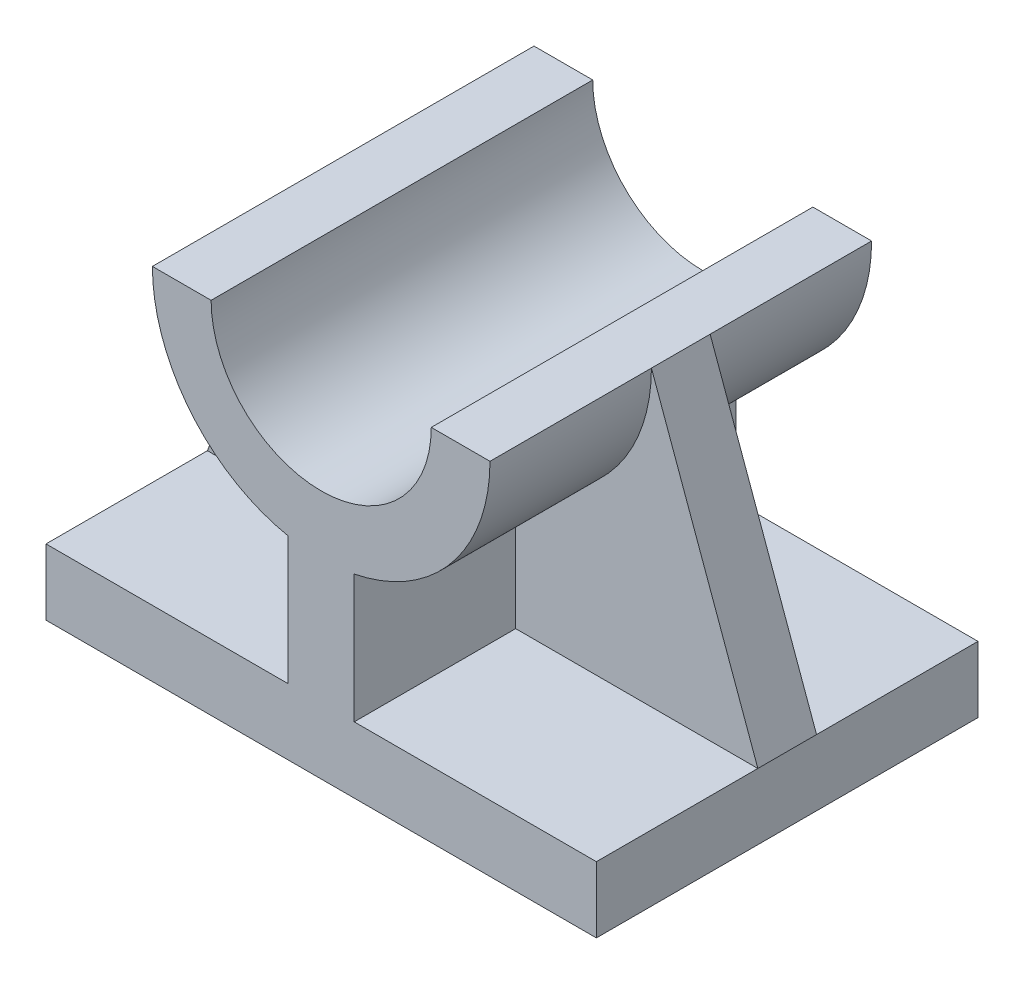
ISO-10303-21;
HEADER;
FILE_DESCRIPTION(('STEP AP214'),'2;1');
FILE_NAME('part.step','',(''),(''),'','','');
FILE_SCHEMA(('AUTOMOTIVE_DESIGN { 1 0 10303 214 1 1 1 1 }'));
ENDSEC;
DATA;
#1=APPLICATION_CONTEXT('core data for automotive mechanical design processes');
#2=APPLICATION_PROTOCOL_DEFINITION('international standard','automotive_design',2000,#1);
#3=PRODUCT_CONTEXT('',#1,'mechanical');
#4=PRODUCT('Part','Part','',(#3));
#5=PRODUCT_RELATED_PRODUCT_CATEGORY('part','',(#4));
#6=PRODUCT_DEFINITION_FORMATION('','',#4);
#7=PRODUCT_DEFINITION_CONTEXT('part definition',#1,'design');
#8=PRODUCT_DEFINITION('design','',#6,#7);
#9=PRODUCT_DEFINITION_SHAPE('','',#8);
#10=(LENGTH_UNIT() NAMED_UNIT(*) SI_UNIT(.MILLI.,.METRE.));
#11=(NAMED_UNIT(*) PLANE_ANGLE_UNIT() SI_UNIT($,.RADIAN.));
#12=(NAMED_UNIT(*) SI_UNIT($,.STERADIAN.) SOLID_ANGLE_UNIT());
#13=UNCERTAINTY_MEASURE_WITH_UNIT(LENGTH_MEASURE(1.E-05),#10,'distance_accuracy_value','');
#14=(GEOMETRIC_REPRESENTATION_CONTEXT(3) GLOBAL_UNCERTAINTY_ASSIGNED_CONTEXT((#13)) GLOBAL_UNIT_ASSIGNED_CONTEXT((#10,
#11,#12)) REPRESENTATION_CONTEXT('',''));
#15=CARTESIAN_POINT('',(0.,0.,0.));
#16=DIRECTION('',(0.,0.,1.));
#17=DIRECTION('',(1.,0.,0.));
#18=AXIS2_PLACEMENT_3D('',#15,#16,#17);
#19=CARTESIAN_POINT('',(0.,1130.3,660.4));
#20=DIRECTION('',(0.,0.,-1.));
#21=DIRECTION('',(-1.,0.,0.));
#22=AXIS2_PLACEMENT_3D('',#19,#20,#21);
#23=CYLINDRICAL_SURFACE('',#22,584.2);
#24=CARTESIAN_POINT('',(0.,1130.3,-101.6));
#25=DIRECTION('',(0.,0.,1.));
#26=DIRECTION('',(1.,0.,0.));
#27=AXIS2_PLACEMENT_3D('',#24,#25,#26);
#28=CIRCLE('',#27,584.2);
#29=CARTESIAN_POINT('',(-584.2,1130.3,-101.6));
#30=VERTEX_POINT('',#29);
#31=CARTESIAN_POINT('',(-114.3,557.39062671309,-101.6));
#32=VERTEX_POINT('',#31);
#33=EDGE_CURVE('E193',#30,#32,#28,.T.);
#34=ORIENTED_EDGE('',*,*,#33,.F.);
#35=DIRECTION('',(0.,0.,-1.));
#36=VECTOR('',#35,1.);
#37=CARTESIAN_POINT('',(-584.2,1130.3,660.4));
#38=LINE('',#37,#36);
#39=CARTESIAN_POINT('',(-584.2,1130.3,-660.4));
#40=VERTEX_POINT('',#39);
#41=EDGE_CURVE('E203',#30,#40,#38,.T.);
#42=ORIENTED_EDGE('',*,*,#41,.T.);
#43=CARTESIAN_POINT('',(0.,1130.3,-660.4));
#44=DIRECTION('',(0.,0.,1.));
#45=DIRECTION('',(1.,0.,0.));
#46=AXIS2_PLACEMENT_3D('',#43,#44,#45);
#47=CIRCLE('',#46,584.2);
#48=CARTESIAN_POINT('',(-114.3,557.39062671309,-660.4));
#49=VERTEX_POINT('',#48);
#50=EDGE_CURVE('E293',#40,#49,#47,.T.);
#51=ORIENTED_EDGE('',*,*,#50,.T.);
#52=DIRECTION('',(0.,0.,-1.));
#53=VECTOR('',#52,1.);
#54=CARTESIAN_POINT('',(-114.3,557.39062671309,660.4));
#55=LINE('',#54,#53);
#56=EDGE_CURVE('E205',#32,#49,#55,.T.);
#57=ORIENTED_EDGE('',*,*,#56,.F.);
#58=EDGE_LOOP('',(#34,#42,#51,#57));
#59=FACE_BOUND('',#58,.T.);
#60=ADVANCED_FACE('F42',(#59),#23,.T.);
#61=CARTESIAN_POINT('',(-114.3,114.3,660.4));
#62=DIRECTION('',(1.,0.,0.));
#63=DIRECTION('',(0.,0.,-1.));
#64=AXIS2_PLACEMENT_3D('',#61,#62,#63);
#65=PLANE('',#64);
#66=DIRECTION('',(0.,-1.,0.));
#67=VECTOR('',#66,1.);
#68=CARTESIAN_POINT('',(-114.3,114.3,-101.6));
#69=LINE('',#68,#67);
#70=CARTESIAN_POINT('',(-114.3,114.3,-101.6));
#71=VERTEX_POINT('',#70);
#72=EDGE_CURVE('E208',#32,#71,#69,.T.);
#73=ORIENTED_EDGE('',*,*,#72,.F.);
#74=ORIENTED_EDGE('',*,*,#56,.T.);
#75=DIRECTION('',(0.,-1.,0.));
#76=VECTOR('',#75,1.);
#77=CARTESIAN_POINT('',(-114.3,114.3,-660.4));
#78=LINE('',#77,#76);
#79=CARTESIAN_POINT('',(-114.3,114.3,-660.4));
#80=VERTEX_POINT('',#79);
#81=EDGE_CURVE('E296',#49,#80,#78,.T.);
#82=ORIENTED_EDGE('',*,*,#81,.T.);
#83=DIRECTION('',(0.,0.,-1.));
#84=VECTOR('',#83,1.);
#85=CARTESIAN_POINT('',(-114.3,114.3,660.4));
#86=LINE('',#85,#84);
#87=EDGE_CURVE('E324',#71,#80,#86,.T.);
#88=ORIENTED_EDGE('',*,*,#87,.F.);
#89=EDGE_LOOP('',(#73,#74,#82,#88));
#90=FACE_BOUND('',#89,.T.);
#91=ADVANCED_FACE('F342',(#90),#65,.F.);
#92=CARTESIAN_POINT('',(-952.500000000001,114.3,660.4));
#93=DIRECTION('',(0.,-1.,0.));
#94=DIRECTION('',(1.,0.,0.));
#95=AXIS2_PLACEMENT_3D('',#92,#93,#94);
#96=PLANE('',#95);
#97=DIRECTION('',(-1.,0.,0.));
#98=VECTOR('',#97,1.);
#99=CARTESIAN_POINT('',(-952.500000000001,114.3,-101.6));
#100=LINE('',#99,#98);
#101=CARTESIAN_POINT('',(-952.500000000001,114.3,-101.6));
#102=VERTEX_POINT('',#101);
#103=EDGE_CURVE('E196',#71,#102,#100,.T.);
#104=ORIENTED_EDGE('',*,*,#103,.F.);
#105=ORIENTED_EDGE('',*,*,#87,.T.);
#106=DIRECTION('',(-1.,0.,0.));
#107=VECTOR('',#106,1.);
#108=CARTESIAN_POINT('',(-952.500000000001,114.3,-660.4));
#109=LINE('',#108,#107);
#110=CARTESIAN_POINT('',(-952.500000000001,114.3,-660.4));
#111=VERTEX_POINT('',#110);
#112=EDGE_CURVE('E300',#80,#111,#109,.T.);
#113=ORIENTED_EDGE('',*,*,#112,.T.);
#114=DIRECTION('',(0.,0.,-1.));
#115=VECTOR('',#114,1.);
#116=CARTESIAN_POINT('',(-952.500000000001,114.3,660.4));
#117=LINE('',#116,#115);
#118=EDGE_CURVE('E320',#102,#111,#117,.T.);
#119=ORIENTED_EDGE('',*,*,#118,.F.);
#120=EDGE_LOOP('',(#104,#105,#113,#119));
#121=FACE_BOUND('',#120,.T.);
#122=ADVANCED_FACE('F337',(#121),#96,.F.);
#123=CARTESIAN_POINT('',(114.3,114.3,660.4));
#124=DIRECTION('',(0.,-1.,0.));
#125=DIRECTION('',(1.,0.,0.));
#126=AXIS2_PLACEMENT_3D('',#123,#124,#125);
#127=PLANE('',#126);
#128=DIRECTION('',(-1.,0.,0.));
#129=VECTOR('',#128,1.);
#130=CARTESIAN_POINT('',(114.3,114.3,-101.6));
#131=LINE('',#130,#129);
#132=CARTESIAN_POINT('',(952.499999999999,114.3,-101.6));
#133=VERTEX_POINT('',#132);
#134=CARTESIAN_POINT('',(114.3,114.3,-101.6));
#135=VERTEX_POINT('',#134);
#136=EDGE_CURVE('E409',#133,#135,#131,.T.);
#137=ORIENTED_EDGE('',*,*,#136,.F.);
#138=DIRECTION('',(0.,0.,-1.));
#139=VECTOR('',#138,1.);
#140=CARTESIAN_POINT('',(952.499999999999,114.3,660.4));
#141=LINE('',#140,#139);
#142=CARTESIAN_POINT('',(952.499999999999,114.3,-660.4));
#143=VERTEX_POINT('',#142);
#144=EDGE_CURVE('E51',#133,#143,#141,.T.);
#145=ORIENTED_EDGE('',*,*,#144,.T.);
#146=DIRECTION('',(-1.,0.,0.));
#147=VECTOR('',#146,1.);
#148=CARTESIAN_POINT('',(114.3,114.3,-660.4));
#149=LINE('',#148,#147);
#150=CARTESIAN_POINT('',(114.3,114.3,-660.4));
#151=VERTEX_POINT('',#150);
#152=EDGE_CURVE('E264',#143,#151,#149,.T.);
#153=ORIENTED_EDGE('',*,*,#152,.T.);
#154=DIRECTION('',(0.,0.,-1.));
#155=VECTOR('',#154,1.);
#156=CARTESIAN_POINT('',(114.3,114.3,660.4));
#157=LINE('',#156,#155);
#158=EDGE_CURVE('E240',#135,#151,#157,.T.);
#159=ORIENTED_EDGE('',*,*,#158,.F.);
#160=EDGE_LOOP('',(#137,#145,#153,#159));
#161=FACE_BOUND('',#160,.T.);
#162=ADVANCED_FACE('F265',(#161),#127,.F.);
#163=CARTESIAN_POINT('',(114.3,114.3,660.4));
#164=DIRECTION('',(-1.,0.,0.));
#165=DIRECTION('',(0.,0.,1.));
#166=AXIS2_PLACEMENT_3D('',#163,#164,#165);
#167=PLANE('',#166);
#168=DIRECTION('',(0.,1.,0.));
#169=VECTOR('',#168,1.);
#170=CARTESIAN_POINT('',(114.3,114.3,-101.6));
#171=LINE('',#170,#169);
#172=CARTESIAN_POINT('',(114.3,557.39062671309,-101.6));
#173=VERTEX_POINT('',#172);
#174=EDGE_CURVE('E260',#135,#173,#171,.T.);
#175=ORIENTED_EDGE('',*,*,#174,.F.);
#176=ORIENTED_EDGE('',*,*,#158,.T.);
#177=DIRECTION('',(0.,1.,0.));
#178=VECTOR('',#177,1.);
#179=CARTESIAN_POINT('',(114.3,114.3,-660.4));
#180=LINE('',#179,#178);
#181=CARTESIAN_POINT('',(114.3,557.39062671309,-660.4));
#182=VERTEX_POINT('',#181);
#183=EDGE_CURVE('E258',#151,#182,#180,.T.);
#184=ORIENTED_EDGE('',*,*,#183,.T.);
#185=DIRECTION('',(0.,0.,-1.));
#186=VECTOR('',#185,1.);
#187=CARTESIAN_POINT('',(114.3,557.39062671309,660.4));
#188=LINE('',#187,#186);
#189=EDGE_CURVE('E235',#173,#182,#188,.T.);
#190=ORIENTED_EDGE('',*,*,#189,.F.);
#191=EDGE_LOOP('',(#175,#176,#184,#190));
#192=FACE_BOUND('',#191,.T.);
#193=ADVANCED_FACE('F255',(#192),#167,.F.);
#194=CARTESIAN_POINT('',(0.,1130.3,660.4));
#195=DIRECTION('',(0.,0.,-1.));
#196=DIRECTION('',(-1.,0.,0.));
#197=AXIS2_PLACEMENT_3D('',#194,#195,#196);
#198=CYLINDRICAL_SURFACE('',#197,584.2);
#199=CARTESIAN_POINT('',(0.,1130.3,-101.6));
#200=DIRECTION('',(0.,0.,1.));
#201=DIRECTION('',(1.,0.,0.));
#202=AXIS2_PLACEMENT_3D('',#199,#200,#201);
#203=CIRCLE('',#202,584.2);
#204=CARTESIAN_POINT('',(584.2,1130.3,-101.6));
#205=VERTEX_POINT('',#204);
#206=EDGE_CURVE('E414',#173,#205,#203,.T.);
#207=ORIENTED_EDGE('',*,*,#206,.F.);
#208=ORIENTED_EDGE('',*,*,#189,.T.);
#209=CARTESIAN_POINT('',(0.,1130.3,-660.4));
#210=DIRECTION('',(0.,0.,1.));
#211=DIRECTION('',(1.,0.,0.));
#212=AXIS2_PLACEMENT_3D('',#209,#210,#211);
#213=CIRCLE('',#212,584.2);
#214=CARTESIAN_POINT('',(584.2,1130.3,-660.4));
#215=VERTEX_POINT('',#214);
#216=EDGE_CURVE('E276',#182,#215,#213,.T.);
#217=ORIENTED_EDGE('',*,*,#216,.T.);
#218=DIRECTION('',(0.,0.,-1.));
#219=VECTOR('',#218,1.);
#220=CARTESIAN_POINT('',(584.2,1130.3,660.4));
#221=LINE('',#220,#219);
#222=EDGE_CURVE('E230',#205,#215,#221,.T.);
#223=ORIENTED_EDGE('',*,*,#222,.F.);
#224=EDGE_LOOP('',(#207,#208,#217,#223));
#225=FACE_BOUND('',#224,.T.);
#226=ADVANCED_FACE('F465',(#225),#198,.T.);
#227=CARTESIAN_POINT('',(952.499999999999,114.3,660.4));
#228=DIRECTION('',(-1.,0.,0.));
#229=DIRECTION('',(0.,0.,1.));
#230=AXIS2_PLACEMENT_3D('',#227,#228,#229);
#231=PLANE('',#230);
#232=DIRECTION('',(0.,0.,-1.));
#233=VECTOR('',#232,1.);
#234=CARTESIAN_POINT('',(952.499999999999,-114.3,660.4));
#235=LINE('',#234,#233);
#236=CARTESIAN_POINT('',(952.499999999999,-114.3,660.4));
#237=VERTEX_POINT('',#236);
#238=CARTESIAN_POINT('',(952.499999999999,-114.3,-660.4));
#239=VERTEX_POINT('',#238);
#240=EDGE_CURVE('E313',#237,#239,#235,.T.);
#241=ORIENTED_EDGE('',*,*,#240,.T.);
#242=DIRECTION('',(0.,1.,0.));
#243=VECTOR('',#242,1.);
#244=CARTESIAN_POINT('',(952.499999999999,114.3,-660.4));
#245=LINE('',#244,#243);
#246=EDGE_CURVE('E271',#239,#143,#245,.T.);
#247=ORIENTED_EDGE('',*,*,#246,.T.);
#248=ORIENTED_EDGE('',*,*,#144,.F.);
#249=DIRECTION('',(0.,0.,-1.));
#250=VECTOR('',#249,1.);
#251=CARTESIAN_POINT('',(952.499999999999,114.3,660.4));
#252=LINE('',#251,#250);
#253=CARTESIAN_POINT('',(952.499999999999,114.3,101.6));
#254=VERTEX_POINT('',#253);
#255=EDGE_CURVE('E391',#133,#254,#252,.F.);
#256=ORIENTED_EDGE('',*,*,#255,.T.);
#257=CARTESIAN_POINT('',(952.499999999999,114.3,660.4));
#258=VERTEX_POINT('',#257);
#259=EDGE_CURVE('E11',#258,#254,#141,.T.);
#260=ORIENTED_EDGE('',*,*,#259,.F.);
#261=DIRECTION('',(0.,1.,0.));
#262=VECTOR('',#261,1.);
#263=CARTESIAN_POINT('',(952.499999999999,114.3,660.4));
#264=LINE('',#263,#262);
#265=EDGE_CURVE('E312',#237,#258,#264,.T.);
#266=ORIENTED_EDGE('',*,*,#265,.F.);
#267=EDGE_LOOP('',(#241,#247,#248,#256,#260,#266));
#268=FACE_BOUND('',#267,.T.);
#269=ADVANCED_FACE('F44',(#268),#231,.F.);
#270=ORIENTED_EDGE('',*,*,#259,.T.);
#271=DIRECTION('',(-1.,0.,0.));
#272=VECTOR('',#271,1.);
#273=CARTESIAN_POINT('',(114.3,114.3,101.6));
#274=LINE('',#273,#272);
#275=CARTESIAN_POINT('',(114.3,114.3,101.6));
#276=VERTEX_POINT('',#275);
#277=EDGE_CURVE('E397',#254,#276,#274,.T.);
#278=ORIENTED_EDGE('',*,*,#277,.T.);
#279=CARTESIAN_POINT('',(114.3,114.3,660.4));
#280=VERTEX_POINT('',#279);
#281=EDGE_CURVE('E241',#280,#276,#157,.T.);
#282=ORIENTED_EDGE('',*,*,#281,.F.);
#283=DIRECTION('',(-1.,0.,0.));
#284=VECTOR('',#283,1.);
#285=CARTESIAN_POINT('',(114.3,114.3,660.4));
#286=LINE('',#285,#284);
#287=EDGE_CURVE('E381',#258,#280,#286,.T.);
#288=ORIENTED_EDGE('',*,*,#287,.F.);
#289=EDGE_LOOP('',(#270,#278,#282,#288));
#290=FACE_BOUND('',#289,.T.);
#291=ADVANCED_FACE('F471',(#290),#127,.F.);
#292=ORIENTED_EDGE('',*,*,#281,.T.);
#293=DIRECTION('',(0.,1.,0.));
#294=VECTOR('',#293,1.);
#295=CARTESIAN_POINT('',(114.3,114.3,101.6));
#296=LINE('',#295,#294);
#297=CARTESIAN_POINT('',(114.3,557.39062671309,101.6));
#298=VERTEX_POINT('',#297);
#299=EDGE_CURVE('E400',#276,#298,#296,.T.);
#300=ORIENTED_EDGE('',*,*,#299,.T.);
#301=CARTESIAN_POINT('',(114.3,557.39062671309,660.4));
#302=VERTEX_POINT('',#301);
#303=EDGE_CURVE('E237',#302,#298,#188,.T.);
#304=ORIENTED_EDGE('',*,*,#303,.F.);
#305=DIRECTION('',(0.,1.,0.));
#306=VECTOR('',#305,1.);
#307=CARTESIAN_POINT('',(114.3,114.3,660.4));
#308=LINE('',#307,#306);
#309=EDGE_CURVE('E378',#280,#302,#308,.T.);
#310=ORIENTED_EDGE('',*,*,#309,.F.);
#311=EDGE_LOOP('',(#292,#300,#304,#310));
#312=FACE_BOUND('',#311,.T.);
#313=ADVANCED_FACE('F476',(#312),#167,.F.);
#314=ORIENTED_EDGE('',*,*,#303,.T.);
#315=CARTESIAN_POINT('',(0.,1130.3,101.6));
#316=DIRECTION('',(0.,0.,1.));
#317=DIRECTION('',(1.,0.,0.));
#318=AXIS2_PLACEMENT_3D('',#315,#316,#317);
#319=CIRCLE('',#318,584.2);
#320=CARTESIAN_POINT('',(584.2,1130.3,101.6));
#321=VERTEX_POINT('',#320);
#322=EDGE_CURVE('E403',#298,#321,#319,.T.);
#323=ORIENTED_EDGE('',*,*,#322,.T.);
#324=CARTESIAN_POINT('',(584.2,1130.3,660.4));
#325=VERTEX_POINT('',#324);
#326=EDGE_CURVE('E231',#325,#321,#221,.T.);
#327=ORIENTED_EDGE('',*,*,#326,.F.);
#328=CARTESIAN_POINT('',(0.,1130.3,660.4));
#329=DIRECTION('',(0.,0.,1.));
#330=DIRECTION('',(1.,0.,0.));
#331=AXIS2_PLACEMENT_3D('',#328,#329,#330);
#332=CIRCLE('',#331,584.2);
#333=EDGE_CURVE('E375',#302,#325,#332,.T.);
#334=ORIENTED_EDGE('',*,*,#333,.F.);
#335=EDGE_LOOP('',(#314,#323,#327,#334));
#336=FACE_BOUND('',#335,.T.);
#337=ADVANCED_FACE('F478',(#336),#198,.T.);
#338=CARTESIAN_POINT('',(381.,1130.3,660.4));
#339=DIRECTION('',(0.,-1.,0.));
#340=DIRECTION('',(0.,0.,-1.));
#341=AXIS2_PLACEMENT_3D('',#338,#339,#340);
#342=PLANE('',#341);
#343=ORIENTED_EDGE('',*,*,#326,.T.);
#344=EDGE_CURVE('E236',#321,#205,#221,.T.);
#345=ORIENTED_EDGE('',*,*,#344,.T.);
#346=ORIENTED_EDGE('',*,*,#222,.T.);
#347=DIRECTION('',(-1.,0.,0.));
#348=VECTOR('',#347,1.);
#349=CARTESIAN_POINT('',(381.,1130.3,-660.4));
#350=LINE('',#349,#348);
#351=CARTESIAN_POINT('',(381.,1130.3,-660.4));
#352=VERTEX_POINT('',#351);
#353=EDGE_CURVE('E280',#215,#352,#350,.T.);
#354=ORIENTED_EDGE('',*,*,#353,.T.);
#355=DIRECTION('',(0.,0.,-1.));
#356=VECTOR('',#355,1.);
#357=CARTESIAN_POINT('',(381.,1130.3,660.4));
#358=LINE('',#357,#356);
#359=CARTESIAN_POINT('',(381.,1130.3,660.4));
#360=VERTEX_POINT('',#359);
#361=EDGE_CURVE('E227',#360,#352,#358,.T.);
#362=ORIENTED_EDGE('',*,*,#361,.F.);
#363=DIRECTION('',(-1.,0.,0.));
#364=VECTOR('',#363,1.);
#365=CARTESIAN_POINT('',(381.,1130.3,660.4));
#366=LINE('',#365,#364);
#367=EDGE_CURVE('E372',#325,#360,#366,.T.);
#368=ORIENTED_EDGE('',*,*,#367,.F.);
#369=EDGE_LOOP('',(#343,#345,#346,#354,#362,#368));
#370=FACE_BOUND('',#369,.T.);
#371=ADVANCED_FACE('F459',(#370),#342,.F.);
#372=CARTESIAN_POINT('',(0.,1130.3,660.4));
#373=DIRECTION('',(0.,0.,-1.));
#374=DIRECTION('',(-1.,0.,0.));
#375=AXIS2_PLACEMENT_3D('',#372,#373,#374);
#376=CYLINDRICAL_SURFACE('',#375,381.);
#377=ORIENTED_EDGE('',*,*,#361,.T.);
#378=CARTESIAN_POINT('',(0.,1130.3,-660.4));
#379=DIRECTION('',(0.,0.,-1.));
#380=DIRECTION('',(1.,0.,0.));
#381=AXIS2_PLACEMENT_3D('',#378,#379,#380);
#382=CIRCLE('',#381,381.);
#383=CARTESIAN_POINT('',(-381.,1130.3,-660.4));
#384=VERTEX_POINT('',#383);
#385=EDGE_CURVE('E287',#352,#384,#382,.T.);
#386=ORIENTED_EDGE('',*,*,#385,.T.);
#387=DIRECTION('',(0.,0.,-1.));
#388=VECTOR('',#387,1.);
#389=CARTESIAN_POINT('',(-381.,1130.3,660.4));
#390=LINE('',#389,#388);
#391=CARTESIAN_POINT('',(-381.,1130.3,660.4));
#392=VERTEX_POINT('',#391);
#393=EDGE_CURVE('E220',#392,#384,#390,.T.);
#394=ORIENTED_EDGE('',*,*,#393,.F.);
#395=CARTESIAN_POINT('',(0.,1130.3,660.4));
#396=DIRECTION('',(0.,0.,-1.));
#397=DIRECTION('',(1.,0.,0.));
#398=AXIS2_PLACEMENT_3D('',#395,#396,#397);
#399=CIRCLE('',#398,381.);
#400=EDGE_CURVE('E369',#360,#392,#399,.T.);
#401=ORIENTED_EDGE('',*,*,#400,.F.);
#402=EDGE_LOOP('',(#377,#386,#394,#401));
#403=FACE_BOUND('',#402,.T.);
#404=ADVANCED_FACE('F456',(#403),#376,.F.);
#405=CARTESIAN_POINT('',(-584.2,1130.3,660.4));
#406=DIRECTION('',(0.,-1.,0.));
#407=DIRECTION('',(0.,0.,-1.));
#408=AXIS2_PLACEMENT_3D('',#405,#406,#407);
#409=PLANE('',#408);
#410=ORIENTED_EDGE('',*,*,#393,.T.);
#411=DIRECTION('',(-1.,0.,0.));
#412=VECTOR('',#411,1.);
#413=CARTESIAN_POINT('',(-584.2,1130.3,-660.4));
#414=LINE('',#413,#412);
#415=EDGE_CURVE('E212',#384,#40,#414,.T.);
#416=ORIENTED_EDGE('',*,*,#415,.T.);
#417=ORIENTED_EDGE('',*,*,#41,.F.);
#418=DIRECTION('',(0.,0.,-1.));
#419=VECTOR('',#418,1.);
#420=CARTESIAN_POINT('',(-584.2,1130.3,660.4));
#421=LINE('',#420,#419);
#422=CARTESIAN_POINT('',(-584.2,1130.3,101.6));
#423=VERTEX_POINT('',#422);
#424=EDGE_CURVE('E179',#30,#423,#421,.F.);
#425=ORIENTED_EDGE('',*,*,#424,.T.);
#426=CARTESIAN_POINT('',(-584.2,1130.3,660.4));
#427=VERTEX_POINT('',#426);
#428=EDGE_CURVE('E215',#427,#423,#38,.T.);
#429=ORIENTED_EDGE('',*,*,#428,.F.);
#430=DIRECTION('',(-1.,0.,0.));
#431=VECTOR('',#430,1.);
#432=CARTESIAN_POINT('',(-584.2,1130.3,660.4));
#433=LINE('',#432,#431);
#434=EDGE_CURVE('E366',#392,#427,#433,.T.);
#435=ORIENTED_EDGE('',*,*,#434,.F.);
#436=EDGE_LOOP('',(#410,#416,#417,#425,#429,#435));
#437=FACE_BOUND('',#436,.T.);
#438=ADVANCED_FACE('F210',(#437),#409,.F.);
#439=ORIENTED_EDGE('',*,*,#428,.T.);
#440=CARTESIAN_POINT('',(0.,1130.3,101.6));
#441=DIRECTION('',(0.,0.,1.));
#442=DIRECTION('',(1.,0.,0.));
#443=AXIS2_PLACEMENT_3D('',#440,#441,#442);
#444=CIRCLE('',#443,584.2);
#445=CARTESIAN_POINT('',(-114.3,557.39062671309,101.6));
#446=VERTEX_POINT('',#445);
#447=EDGE_CURVE('E207',#423,#446,#444,.T.);
#448=ORIENTED_EDGE('',*,*,#447,.T.);
#449=CARTESIAN_POINT('',(-114.3,557.39062671309,660.4));
#450=VERTEX_POINT('',#449);
#451=EDGE_CURVE('E216',#450,#446,#55,.T.);
#452=ORIENTED_EDGE('',*,*,#451,.F.);
#453=CARTESIAN_POINT('',(0.,1130.3,660.4));
#454=DIRECTION('',(0.,0.,1.));
#455=DIRECTION('',(1.,0.,0.));
#456=AXIS2_PLACEMENT_3D('',#453,#454,#455);
#457=CIRCLE('',#456,584.2);
#458=EDGE_CURVE('E363',#427,#450,#457,.T.);
#459=ORIENTED_EDGE('',*,*,#458,.F.);
#460=EDGE_LOOP('',(#439,#448,#452,#459));
#461=FACE_BOUND('',#460,.T.);
#462=ADVANCED_FACE('F449',(#461),#23,.T.);
#463=ORIENTED_EDGE('',*,*,#451,.T.);
#464=DIRECTION('',(0.,-1.,0.));
#465=VECTOR('',#464,1.);
#466=CARTESIAN_POINT('',(-114.3,114.3,101.6));
#467=LINE('',#466,#465);
#468=CARTESIAN_POINT('',(-114.3,114.3,101.6));
#469=VERTEX_POINT('',#468);
#470=EDGE_CURVE('E425',#446,#469,#467,.T.);
#471=ORIENTED_EDGE('',*,*,#470,.T.);
#472=CARTESIAN_POINT('',(-114.3,114.3,660.4));
#473=VERTEX_POINT('',#472);
#474=EDGE_CURVE('E326',#473,#469,#86,.T.);
#475=ORIENTED_EDGE('',*,*,#474,.F.);
#476=DIRECTION('',(0.,-1.,0.));
#477=VECTOR('',#476,1.);
#478=CARTESIAN_POINT('',(-114.3,114.3,660.4));
#479=LINE('',#478,#477);
#480=EDGE_CURVE('E360',#450,#473,#479,.T.);
#481=ORIENTED_EDGE('',*,*,#480,.F.);
#482=EDGE_LOOP('',(#463,#471,#475,#481));
#483=FACE_BOUND('',#482,.T.);
#484=ADVANCED_FACE('F447',(#483),#65,.F.);
#485=ORIENTED_EDGE('',*,*,#474,.T.);
#486=DIRECTION('',(-1.,0.,0.));
#487=VECTOR('',#486,1.);
#488=CARTESIAN_POINT('',(-952.500000000001,114.3,101.6));
#489=LINE('',#488,#487);
#490=CARTESIAN_POINT('',(-952.500000000001,114.299999999995,101.6));
#491=VERTEX_POINT('',#490);
#492=EDGE_CURVE('E188',#469,#491,#489,.T.);
#493=ORIENTED_EDGE('',*,*,#492,.T.);
#494=CARTESIAN_POINT('',(-952.500000000001,114.3,660.4));
#495=VERTEX_POINT('',#494);
#496=EDGE_CURVE('E321',#495,#491,#117,.T.);
#497=ORIENTED_EDGE('',*,*,#496,.F.);
#498=DIRECTION('',(-1.,0.,0.));
#499=VECTOR('',#498,1.);
#500=CARTESIAN_POINT('',(-952.500000000001,114.3,660.4));
#501=LINE('',#500,#499);
#502=EDGE_CURVE('E357',#473,#495,#501,.T.);
#503=ORIENTED_EDGE('',*,*,#502,.F.);
#504=EDGE_LOOP('',(#485,#493,#497,#503));
#505=FACE_BOUND('',#504,.T.);
#506=ADVANCED_FACE('F440',(#505),#96,.F.);
#507=CARTESIAN_POINT('',(-952.500000000001,114.3,660.4));
#508=DIRECTION('',(1.,0.,0.));
#509=DIRECTION('',(0.,1.,0.));
#510=AXIS2_PLACEMENT_3D('',#507,#508,#509);
#511=PLANE('',#510);
#512=ORIENTED_EDGE('',*,*,#496,.T.);
#513=EDGE_CURVE('E325',#491,#102,#117,.T.);
#514=ORIENTED_EDGE('',*,*,#513,.T.);
#515=ORIENTED_EDGE('',*,*,#118,.T.);
#516=DIRECTION('',(0.,-1.,0.));
#517=VECTOR('',#516,1.);
#518=CARTESIAN_POINT('',(-952.500000000001,114.3,-660.4));
#519=LINE('',#518,#517);
#520=CARTESIAN_POINT('',(-952.500000000001,-114.3,-660.4));
#521=VERTEX_POINT('',#520);
#522=EDGE_CURVE('E304',#111,#521,#519,.T.);
#523=ORIENTED_EDGE('',*,*,#522,.T.);
#524=DIRECTION('',(0.,0.,-1.));
#525=VECTOR('',#524,1.);
#526=CARTESIAN_POINT('',(-952.500000000001,-114.3,660.4));
#527=LINE('',#526,#525);
#528=CARTESIAN_POINT('',(-952.500000000001,-114.3,660.4));
#529=VERTEX_POINT('',#528);
#530=EDGE_CURVE('E316',#529,#521,#527,.T.);
#531=ORIENTED_EDGE('',*,*,#530,.F.);
#532=DIRECTION('',(0.,-1.,0.));
#533=VECTOR('',#532,1.);
#534=CARTESIAN_POINT('',(-952.500000000001,114.3,660.4));
#535=LINE('',#534,#533);
#536=EDGE_CURVE('E354',#495,#529,#535,.T.);
#537=ORIENTED_EDGE('',*,*,#536,.F.);
#538=EDGE_LOOP('',(#512,#514,#515,#523,#531,#537));
#539=FACE_BOUND('',#538,.T.);
#540=ADVANCED_FACE('F346',(#539),#511,.F.);
#541=CARTESIAN_POINT('',(-952.500000000001,-114.3,660.4));
#542=DIRECTION('',(0.,1.,0.));
#543=DIRECTION('',(0.,0.,1.));
#544=AXIS2_PLACEMENT_3D('',#541,#542,#543);
#545=PLANE('',#544);
#546=ORIENTED_EDGE('',*,*,#530,.T.);
#547=DIRECTION('',(1.,0.,0.));
#548=VECTOR('',#547,1.);
#549=CARTESIAN_POINT('',(-952.500000000001,-114.3,-660.4));
#550=LINE('',#549,#548);
#551=EDGE_CURVE('E308',#521,#239,#550,.T.);
#552=ORIENTED_EDGE('',*,*,#551,.T.);
#553=ORIENTED_EDGE('',*,*,#240,.F.);
#554=DIRECTION('',(1.,0.,0.));
#555=VECTOR('',#554,1.);
#556=CARTESIAN_POINT('',(-952.500000000001,-114.3,660.4));
#557=LINE('',#556,#555);
#558=EDGE_CURVE('E317',#529,#237,#557,.T.);
#559=ORIENTED_EDGE('',*,*,#558,.F.);
#560=EDGE_LOOP('',(#546,#552,#553,#559));
#561=FACE_BOUND('',#560,.T.);
#562=ADVANCED_FACE('F518',(#561),#545,.F.);
#563=CARTESIAN_POINT('',(0.,1130.3,660.4));
#564=DIRECTION('',(0.,0.,1.));
#565=DIRECTION('',(1.,0.,0.));
#566=AXIS2_PLACEMENT_3D('',#563,#564,#565);
#567=PLANE('',#566);
#568=ORIENTED_EDGE('',*,*,#265,.T.);
#569=ORIENTED_EDGE('',*,*,#287,.T.);
#570=ORIENTED_EDGE('',*,*,#309,.T.);
#571=ORIENTED_EDGE('',*,*,#333,.T.);
#572=ORIENTED_EDGE('',*,*,#367,.T.);
#573=ORIENTED_EDGE('',*,*,#400,.T.);
#574=ORIENTED_EDGE('',*,*,#434,.T.);
#575=ORIENTED_EDGE('',*,*,#458,.T.);
#576=ORIENTED_EDGE('',*,*,#480,.T.);
#577=ORIENTED_EDGE('',*,*,#502,.T.);
#578=ORIENTED_EDGE('',*,*,#536,.T.);
#579=ORIENTED_EDGE('',*,*,#558,.T.);
#580=EDGE_LOOP('',(#568,#569,#570,#571,#572,#573,#574,#575,#576,#577,#578,#579));
#581=FACE_BOUND('',#580,.T.);
#582=ADVANCED_FACE('F441',(#581),#567,.T.);
#583=CARTESIAN_POINT('',(0.,1130.3,-660.4));
#584=DIRECTION('',(0.,0.,1.));
#585=DIRECTION('',(1.,0.,0.));
#586=AXIS2_PLACEMENT_3D('',#583,#584,#585);
#587=PLANE('',#586);
#588=ORIENTED_EDGE('',*,*,#246,.F.);
#589=ORIENTED_EDGE('',*,*,#551,.F.);
#590=ORIENTED_EDGE('',*,*,#522,.F.);
#591=ORIENTED_EDGE('',*,*,#112,.F.);
#592=ORIENTED_EDGE('',*,*,#81,.F.);
#593=ORIENTED_EDGE('',*,*,#50,.F.);
#594=ORIENTED_EDGE('',*,*,#415,.F.);
#595=ORIENTED_EDGE('',*,*,#385,.F.);
#596=ORIENTED_EDGE('',*,*,#353,.F.);
#597=ORIENTED_EDGE('',*,*,#216,.F.);
#598=ORIENTED_EDGE('',*,*,#183,.F.);
#599=ORIENTED_EDGE('',*,*,#152,.F.);
#600=EDGE_LOOP('',(#588,#589,#590,#591,#592,#593,#594,#595,#596,#597,#598,#599));
#601=FACE_BOUND('',#600,.T.);
#602=ADVANCED_FACE('F273',(#601),#587,.F.);
#603=CARTESIAN_POINT('',(584.2,1130.3,0.));
#604=DIRECTION('',(-0.940136065162483,-0.340799323621399,0.));
#605=DIRECTION('',(0.340799323621399,-0.940136065162483,0.));
#606=AXIS2_PLACEMENT_3D('',#603,#604,#605);
#607=PLANE('',#606);
#608=ORIENTED_EDGE('',*,*,#255,.F.);
#609=DIRECTION('',(0.340799323621399,-0.940136065162483,0.));
#610=VECTOR('',#609,1.);
#611=CARTESIAN_POINT('',(584.2,1130.3,-101.6));
#612=LINE('',#611,#610);
#613=EDGE_CURVE('E66',#205,#133,#612,.T.);
#614=ORIENTED_EDGE('',*,*,#613,.F.);
#615=ORIENTED_EDGE('',*,*,#344,.F.);
#616=DIRECTION('',(0.340799323621399,-0.940136065162483,0.));
#617=VECTOR('',#616,1.);
#618=CARTESIAN_POINT('',(584.2,1130.3,101.6));
#619=LINE('',#618,#617);
#620=EDGE_CURVE('E417',#321,#254,#619,.T.);
#621=ORIENTED_EDGE('',*,*,#620,.T.);
#622=EDGE_LOOP('',(#608,#614,#615,#621));
#623=FACE_BOUND('',#622,.T.);
#624=ADVANCED_FACE('F527',(#623),#607,.F.);
#625=CARTESIAN_POINT('',(-9.99200722162641E-13,508.,101.6));
#626=DIRECTION('',(0.,0.,1.));
#627=DIRECTION('',(1.,0.,0.));
#628=AXIS2_PLACEMENT_3D('',#625,#626,#627);
#629=PLANE('',#628);
#630=ORIENTED_EDGE('',*,*,#277,.F.);
#631=ORIENTED_EDGE('',*,*,#620,.F.);
#632=ORIENTED_EDGE('',*,*,#322,.F.);
#633=ORIENTED_EDGE('',*,*,#299,.F.);
#634=EDGE_LOOP('',(#630,#631,#632,#633));
#635=FACE_BOUND('',#634,.T.);
#636=ADVANCED_FACE('F532',(#635),#629,.T.);
#637=CARTESIAN_POINT('',(-9.99200722162641E-13,508.,-101.6));
#638=DIRECTION('',(0.,0.,1.));
#639=DIRECTION('',(1.,0.,0.));
#640=AXIS2_PLACEMENT_3D('',#637,#638,#639);
#641=PLANE('',#640);
#642=ORIENTED_EDGE('',*,*,#613,.T.);
#643=ORIENTED_EDGE('',*,*,#136,.T.);
#644=ORIENTED_EDGE('',*,*,#174,.T.);
#645=ORIENTED_EDGE('',*,*,#206,.T.);
#646=EDGE_LOOP('',(#642,#643,#644,#645));
#647=FACE_BOUND('',#646,.T.);
#648=ADVANCED_FACE('F469',(#647),#641,.F.);
#649=CARTESIAN_POINT('',(-584.2,1130.3,0.));
#650=DIRECTION('',(-0.940136065162483,0.340799323621399,0.));
#651=DIRECTION('',(-0.340799323621399,-0.940136065162483,0.));
#652=AXIS2_PLACEMENT_3D('',#649,#650,#651);
#653=PLANE('',#652);
#654=ORIENTED_EDGE('',*,*,#424,.F.);
#655=DIRECTION('',(-0.340799323621399,-0.940136065162483,0.));
#656=VECTOR('',#655,1.);
#657=CARTESIAN_POINT('',(-584.2,1130.3,-101.6));
#658=LINE('',#657,#656);
#659=EDGE_CURVE('E58',#30,#102,#658,.T.);
#660=ORIENTED_EDGE('',*,*,#659,.T.);
#661=ORIENTED_EDGE('',*,*,#513,.F.);
#662=DIRECTION('',(-0.340799323621399,-0.940136065162483,0.));
#663=VECTOR('',#662,1.);
#664=CARTESIAN_POINT('',(-584.2,1130.3,101.6));
#665=LINE('',#664,#663);
#666=EDGE_CURVE('E182',#423,#491,#665,.T.);
#667=ORIENTED_EDGE('',*,*,#666,.F.);
#668=EDGE_LOOP('',(#654,#660,#661,#667));
#669=FACE_BOUND('',#668,.T.);
#670=ADVANCED_FACE('F180',(#669),#653,.T.);
#671=CARTESIAN_POINT('',(-9.99200722162641E-13,508.,101.6));
#672=DIRECTION('',(0.,0.,1.));
#673=DIRECTION('',(1.,0.,0.));
#674=AXIS2_PLACEMENT_3D('',#671,#672,#673);
#675=PLANE('',#674);
#676=ORIENTED_EDGE('',*,*,#492,.F.);
#677=ORIENTED_EDGE('',*,*,#470,.F.);
#678=ORIENTED_EDGE('',*,*,#447,.F.);
#679=ORIENTED_EDGE('',*,*,#666,.T.);
#680=EDGE_LOOP('',(#676,#677,#678,#679));
#681=FACE_BOUND('',#680,.T.);
#682=ADVANCED_FACE('F438',(#681),#675,.T.);
#683=CARTESIAN_POINT('',(-9.99200722162641E-13,508.,-101.6));
#684=DIRECTION('',(0.,0.,1.));
#685=DIRECTION('',(1.,0.,0.));
#686=AXIS2_PLACEMENT_3D('',#683,#684,#685);
#687=PLANE('',#686);
#688=ORIENTED_EDGE('',*,*,#659,.F.);
#689=ORIENTED_EDGE('',*,*,#33,.T.);
#690=ORIENTED_EDGE('',*,*,#72,.T.);
#691=ORIENTED_EDGE('',*,*,#103,.T.);
#692=EDGE_LOOP('',(#688,#689,#690,#691));
#693=FACE_BOUND('',#692,.T.);
#694=ADVANCED_FACE('F192',(#693),#687,.F.);
#695=CLOSED_SHELL('',(#60,#91,#122,#162,#193,#226,#269,#291,#313,#337,#371,#404,#438,#462,#484,
#506,#540,#562,#582,#602,#624,#636,#648,#670,#682,#694));
#696=MANIFOLD_SOLID_BREP('B2',#695);
#697=ADVANCED_BREP_SHAPE_REPRESENTATION('',(#18,#696),#14);
#698=SHAPE_DEFINITION_REPRESENTATION(#9,#697);
ENDSEC;
END-ISO-10303-21;
